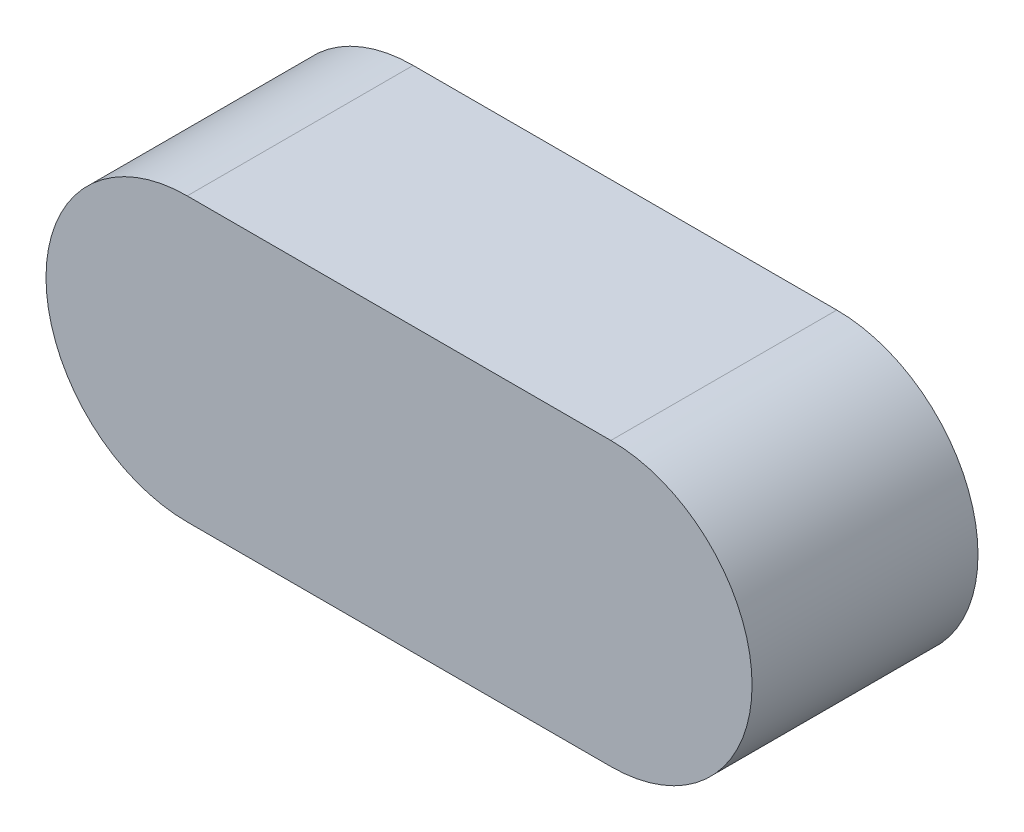
ISO-10303-21;
HEADER;
FILE_DESCRIPTION(('STEP AP214'),'2;1');
FILE_NAME('part.step','',(''),(''),'','','');
FILE_SCHEMA(('AUTOMOTIVE_DESIGN { 1 0 10303 214 1 1 1 1 }'));
ENDSEC;
DATA;
#1=APPLICATION_CONTEXT('core data for automotive mechanical design processes');
#2=APPLICATION_PROTOCOL_DEFINITION('international standard','automotive_design',2000,#1);
#3=PRODUCT_CONTEXT('',#1,'mechanical');
#4=PRODUCT('Part','Part','',(#3));
#5=PRODUCT_RELATED_PRODUCT_CATEGORY('part','',(#4));
#6=PRODUCT_DEFINITION_FORMATION('','',#4);
#7=PRODUCT_DEFINITION_CONTEXT('part definition',#1,'design');
#8=PRODUCT_DEFINITION('design','',#6,#7);
#9=PRODUCT_DEFINITION_SHAPE('','',#8);
#10=(LENGTH_UNIT() NAMED_UNIT(*) SI_UNIT(.MILLI.,.METRE.));
#11=(NAMED_UNIT(*) PLANE_ANGLE_UNIT() SI_UNIT($,.RADIAN.));
#12=(NAMED_UNIT(*) SI_UNIT($,.STERADIAN.) SOLID_ANGLE_UNIT());
#13=UNCERTAINTY_MEASURE_WITH_UNIT(LENGTH_MEASURE(1.E-05),#10,'distance_accuracy_value','');
#14=(GEOMETRIC_REPRESENTATION_CONTEXT(3) GLOBAL_UNCERTAINTY_ASSIGNED_CONTEXT((#13)) GLOBAL_UNIT_ASSIGNED_CONTEXT((#10,
#11,#12)) REPRESENTATION_CONTEXT('',''));
#15=CARTESIAN_POINT('',(0.,0.,0.));
#16=DIRECTION('',(0.,0.,1.));
#17=DIRECTION('',(1.,0.,0.));
#18=AXIS2_PLACEMENT_3D('',#15,#16,#17);
#19=CARTESIAN_POINT('',(9.59926593259926,0.,8.));
#20=DIRECTION('',(0.,0.,-1.));
#21=DIRECTION('',(-1.,0.,0.));
#22=AXIS2_PLACEMENT_3D('',#19,#20,#21);
#23=CYLINDRICAL_SURFACE('',#22,5.);
#24=CARTESIAN_POINT('',(9.59926593259926,0.,0.));
#25=DIRECTION('',(0.,0.,1.));
#26=DIRECTION('',(1.,0.,0.));
#27=AXIS2_PLACEMENT_3D('',#24,#25,#26);
#28=CIRCLE('',#27,5.);
#29=CARTESIAN_POINT('',(9.59926593259926,5.,0.));
#30=VERTEX_POINT('',#29);
#31=CARTESIAN_POINT('',(9.59926593259926,-5.,0.));
#32=VERTEX_POINT('',#31);
#33=EDGE_CURVE('E96',#30,#32,#28,.T.);
#34=ORIENTED_EDGE('',*,*,#33,.T.);
#35=DIRECTION('',(0.,0.,-1.));
#36=VECTOR('',#35,1.);
#37=CARTESIAN_POINT('',(9.59926593259926,-5.,8.));
#38=LINE('',#37,#36);
#39=CARTESIAN_POINT('',(9.59926593259926,-5.,8.));
#40=VERTEX_POINT('',#39);
#41=EDGE_CURVE('E11',#40,#32,#38,.T.);
#42=ORIENTED_EDGE('',*,*,#41,.F.);
#43=CARTESIAN_POINT('',(9.59926593259926,0.,8.));
#44=DIRECTION('',(0.,0.,1.));
#45=DIRECTION('',(1.,0.,0.));
#46=AXIS2_PLACEMENT_3D('',#43,#44,#45);
#47=CIRCLE('',#46,5.);
#48=CARTESIAN_POINT('',(9.59926593259926,5.,8.));
#49=VERTEX_POINT('',#48);
#50=EDGE_CURVE('E84',#49,#40,#47,.T.);
#51=ORIENTED_EDGE('',*,*,#50,.F.);
#52=DIRECTION('',(0.,0.,-1.));
#53=VECTOR('',#52,1.);
#54=CARTESIAN_POINT('',(9.59926593259926,5.,8.));
#55=LINE('',#54,#53);
#56=EDGE_CURVE('E92',#49,#30,#55,.T.);
#57=ORIENTED_EDGE('',*,*,#56,.T.);
#58=EDGE_LOOP('',(#34,#42,#51,#57));
#59=FACE_BOUND('',#58,.T.);
#60=ADVANCED_FACE('F33',(#59),#23,.T.);
#61=CARTESIAN_POINT('',(9.59926593259926,-5.,8.));
#62=DIRECTION('',(0.,1.,0.));
#63=DIRECTION('',(0.,0.,1.));
#64=AXIS2_PLACEMENT_3D('',#61,#62,#63);
#65=PLANE('',#64);
#66=DIRECTION('',(1.,0.,0.));
#67=VECTOR('',#66,1.);
#68=CARTESIAN_POINT('',(9.59926593259926,-5.,0.));
#69=LINE('',#68,#67);
#70=CARTESIAN_POINT('',(24.5992659325993,-5.,0.));
#71=VERTEX_POINT('',#70);
#72=EDGE_CURVE('E88',#32,#71,#69,.T.);
#73=ORIENTED_EDGE('',*,*,#72,.T.);
#74=DIRECTION('',(0.,0.,-1.));
#75=VECTOR('',#74,1.);
#76=CARTESIAN_POINT('',(24.5992659325993,-5.,8.));
#77=LINE('',#76,#75);
#78=CARTESIAN_POINT('',(24.5992659325993,-5.,8.));
#79=VERTEX_POINT('',#78);
#80=EDGE_CURVE('E41',#79,#71,#77,.T.);
#81=ORIENTED_EDGE('',*,*,#80,.F.);
#82=DIRECTION('',(1.,0.,0.));
#83=VECTOR('',#82,1.);
#84=CARTESIAN_POINT('',(9.59926593259926,-5.,8.));
#85=LINE('',#84,#83);
#86=EDGE_CURVE('E79',#40,#79,#85,.T.);
#87=ORIENTED_EDGE('',*,*,#86,.F.);
#88=ORIENTED_EDGE('',*,*,#41,.T.);
#89=EDGE_LOOP('',(#73,#81,#87,#88));
#90=FACE_BOUND('',#89,.T.);
#91=ADVANCED_FACE('F87',(#90),#65,.F.);
#92=CARTESIAN_POINT('',(24.5992659325993,0.,8.));
#93=DIRECTION('',(0.,0.,-1.));
#94=DIRECTION('',(-1.,0.,0.));
#95=AXIS2_PLACEMENT_3D('',#92,#93,#94);
#96=CYLINDRICAL_SURFACE('',#95,5.);
#97=CARTESIAN_POINT('',(24.5992659325993,0.,0.));
#98=DIRECTION('',(0.,0.,1.));
#99=DIRECTION('',(1.,0.,0.));
#100=AXIS2_PLACEMENT_3D('',#97,#98,#99);
#101=CIRCLE('',#100,5.);
#102=CARTESIAN_POINT('',(24.5992659325993,5.,0.));
#103=VERTEX_POINT('',#102);
#104=EDGE_CURVE('E66',#71,#103,#101,.T.);
#105=ORIENTED_EDGE('',*,*,#104,.T.);
#106=DIRECTION('',(0.,0.,-1.));
#107=VECTOR('',#106,1.);
#108=CARTESIAN_POINT('',(24.5992659325993,5.,8.));
#109=LINE('',#108,#107);
#110=CARTESIAN_POINT('',(24.5992659325993,5.,8.));
#111=VERTEX_POINT('',#110);
#112=EDGE_CURVE('E89',#111,#103,#109,.T.);
#113=ORIENTED_EDGE('',*,*,#112,.F.);
#114=CARTESIAN_POINT('',(24.5992659325993,0.,8.));
#115=DIRECTION('',(0.,0.,1.));
#116=DIRECTION('',(1.,0.,0.));
#117=AXIS2_PLACEMENT_3D('',#114,#115,#116);
#118=CIRCLE('',#117,5.);
#119=EDGE_CURVE('E82',#79,#111,#118,.T.);
#120=ORIENTED_EDGE('',*,*,#119,.F.);
#121=ORIENTED_EDGE('',*,*,#80,.T.);
#122=EDGE_LOOP('',(#105,#113,#120,#121));
#123=FACE_BOUND('',#122,.T.);
#124=ADVANCED_FACE('F90',(#123),#96,.T.);
#125=CARTESIAN_POINT('',(9.59926593259926,5.,8.));
#126=DIRECTION('',(0.,-1.,0.));
#127=DIRECTION('',(0.,0.,-1.));
#128=AXIS2_PLACEMENT_3D('',#125,#126,#127);
#129=PLANE('',#128);
#130=DIRECTION('',(-1.,0.,0.));
#131=VECTOR('',#130,1.);
#132=CARTESIAN_POINT('',(9.59926593259926,5.,0.));
#133=LINE('',#132,#131);
#134=EDGE_CURVE('E72',#103,#30,#133,.T.);
#135=ORIENTED_EDGE('',*,*,#134,.T.);
#136=ORIENTED_EDGE('',*,*,#56,.F.);
#137=DIRECTION('',(-1.,0.,0.));
#138=VECTOR('',#137,1.);
#139=CARTESIAN_POINT('',(9.59926593259926,5.,8.));
#140=LINE('',#139,#138);
#141=EDGE_CURVE('E49',#111,#49,#140,.T.);
#142=ORIENTED_EDGE('',*,*,#141,.F.);
#143=ORIENTED_EDGE('',*,*,#112,.T.);
#144=EDGE_LOOP('',(#135,#136,#142,#143));
#145=FACE_BOUND('',#144,.T.);
#146=ADVANCED_FACE('F103',(#145),#129,.F.);
#147=CARTESIAN_POINT('',(9.59926593259926,0.,8.));
#148=DIRECTION('',(0.,0.,1.));
#149=DIRECTION('',(1.,0.,0.));
#150=AXIS2_PLACEMENT_3D('',#147,#148,#149);
#151=PLANE('',#150);
#152=ORIENTED_EDGE('',*,*,#50,.T.);
#153=ORIENTED_EDGE('',*,*,#86,.T.);
#154=ORIENTED_EDGE('',*,*,#119,.T.);
#155=ORIENTED_EDGE('',*,*,#141,.T.);
#156=EDGE_LOOP('',(#152,#153,#154,#155));
#157=FACE_BOUND('',#156,.T.);
#158=ADVANCED_FACE('F80',(#157),#151,.T.);
#159=CARTESIAN_POINT('',(9.59926593259926,0.,0.));
#160=DIRECTION('',(0.,0.,1.));
#161=DIRECTION('',(1.,0.,0.));
#162=AXIS2_PLACEMENT_3D('',#159,#160,#161);
#163=PLANE('',#162);
#164=ORIENTED_EDGE('',*,*,#33,.F.);
#165=ORIENTED_EDGE('',*,*,#134,.F.);
#166=ORIENTED_EDGE('',*,*,#104,.F.);
#167=ORIENTED_EDGE('',*,*,#72,.F.);
#168=EDGE_LOOP('',(#164,#165,#166,#167));
#169=FACE_BOUND('',#168,.T.);
#170=ADVANCED_FACE('F106',(#169),#163,.F.);
#171=CLOSED_SHELL('',(#60,#91,#124,#146,#158,#170));
#172=MANIFOLD_SOLID_BREP('B2',#171);
#173=ADVANCED_BREP_SHAPE_REPRESENTATION('',(#18,#172),#14);
#174=SHAPE_DEFINITION_REPRESENTATION(#9,#173);
ENDSEC;
END-ISO-10303-21;
